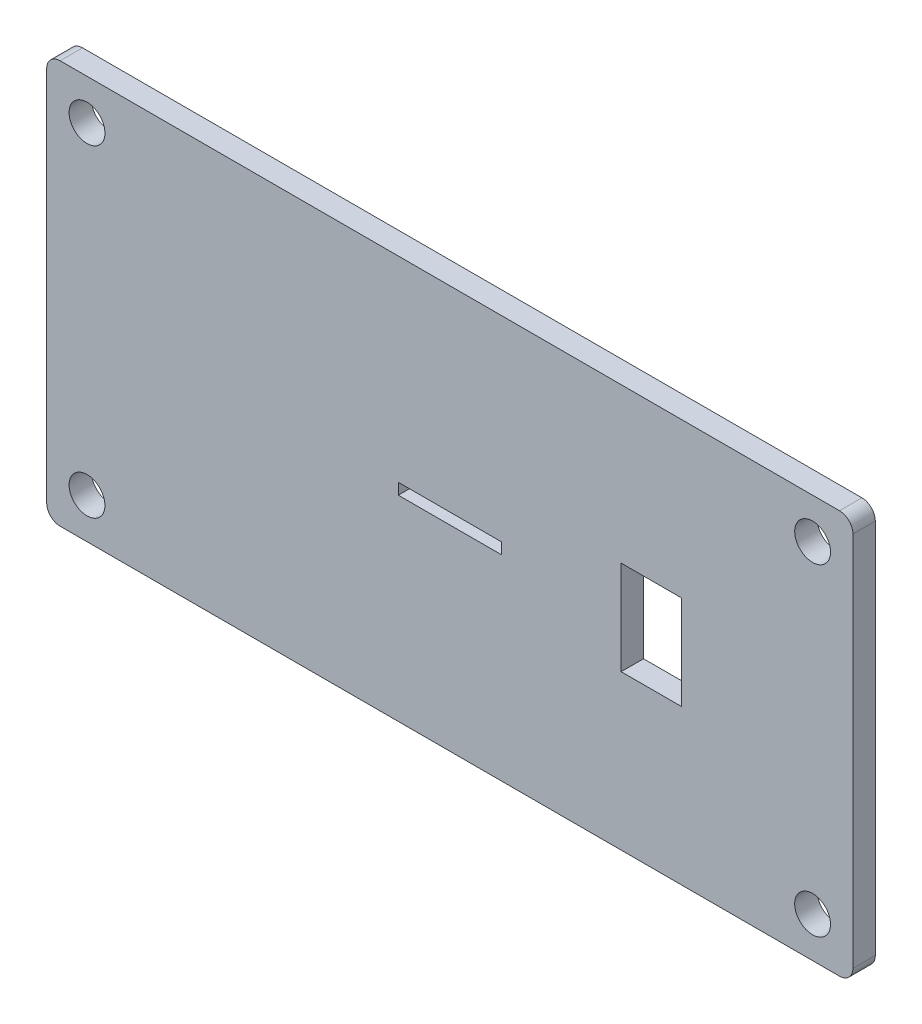
ISO-10303-21;
HEADER;
FILE_DESCRIPTION(('STEP AP214'),'2;1');
FILE_NAME('part.step','',(''),(''),'','','');
FILE_SCHEMA(('AUTOMOTIVE_DESIGN { 1 0 10303 214 1 1 1 1 }'));
ENDSEC;
DATA;
#1=APPLICATION_CONTEXT('core data for automotive mechanical design processes');
#2=APPLICATION_PROTOCOL_DEFINITION('international standard','automotive_design',2000,#1);
#3=PRODUCT_CONTEXT('',#1,'mechanical');
#4=PRODUCT('Part','Part','',(#3));
#5=PRODUCT_RELATED_PRODUCT_CATEGORY('part','',(#4));
#6=PRODUCT_DEFINITION_FORMATION('','',#4);
#7=PRODUCT_DEFINITION_CONTEXT('part definition',#1,'design');
#8=PRODUCT_DEFINITION('design','',#6,#7);
#9=PRODUCT_DEFINITION_SHAPE('','',#8);
#10=(LENGTH_UNIT() NAMED_UNIT(*) SI_UNIT(.MILLI.,.METRE.));
#11=(NAMED_UNIT(*) PLANE_ANGLE_UNIT() SI_UNIT($,.RADIAN.));
#12=(NAMED_UNIT(*) SI_UNIT($,.STERADIAN.) SOLID_ANGLE_UNIT());
#13=UNCERTAINTY_MEASURE_WITH_UNIT(LENGTH_MEASURE(1.E-05),#10,'distance_accuracy_value','');
#14=(GEOMETRIC_REPRESENTATION_CONTEXT(3) GLOBAL_UNCERTAINTY_ASSIGNED_CONTEXT((#13)) GLOBAL_UNIT_ASSIGNED_CONTEXT((#10,
#11,#12)) REPRESENTATION_CONTEXT('',''));
#15=CARTESIAN_POINT('',(0.,0.,0.));
#16=DIRECTION('',(0.,0.,1.));
#17=DIRECTION('',(1.,0.,0.));
#18=AXIS2_PLACEMENT_3D('',#15,#16,#17);
#19=CARTESIAN_POINT('',(90.,45.,5.));
#20=DIRECTION('',(-1.,0.,0.));
#21=DIRECTION('',(0.,0.,1.));
#22=AXIS2_PLACEMENT_3D('',#19,#20,#21);
#23=PLANE('',#22);
#24=DIRECTION('',(0.,1.,0.));
#25=VECTOR('',#24,1.);
#26=CARTESIAN_POINT('',(90.,45.,5.));
#27=LINE('',#26,#25);
#28=CARTESIAN_POINT('',(90.,-42.,5.));
#29=VERTEX_POINT('',#28);
#30=CARTESIAN_POINT('',(90.,42.,5.));
#31=VERTEX_POINT('',#30);
#32=EDGE_CURVE('E238',#29,#31,#27,.T.);
#33=ORIENTED_EDGE('',*,*,#32,.F.);
#34=DIRECTION('',(0.,0.,-1.));
#35=VECTOR('',#34,1.);
#36=CARTESIAN_POINT('',(90.,-42.,5.));
#37=LINE('',#36,#35);
#38=CARTESIAN_POINT('',(90.,-42.,0.));
#39=VERTEX_POINT('',#38);
#40=EDGE_CURVE('E268',#29,#39,#37,.T.);
#41=ORIENTED_EDGE('',*,*,#40,.T.);
#42=DIRECTION('',(0.,1.,0.));
#43=VECTOR('',#42,1.);
#44=CARTESIAN_POINT('',(90.,45.,0.));
#45=LINE('',#44,#43);
#46=CARTESIAN_POINT('',(90.,42.,0.));
#47=VERTEX_POINT('',#46);
#48=EDGE_CURVE('E235',#39,#47,#45,.T.);
#49=ORIENTED_EDGE('',*,*,#48,.T.);
#50=DIRECTION('',(0.,0.,-1.));
#51=VECTOR('',#50,1.);
#52=CARTESIAN_POINT('',(90.,42.,5.));
#53=LINE('',#52,#51);
#54=EDGE_CURVE('E263',#47,#31,#53,.F.);
#55=ORIENTED_EDGE('',*,*,#54,.T.);
#56=EDGE_LOOP('',(#33,#41,#49,#55));
#57=FACE_BOUND('',#56,.T.);
#58=ADVANCED_FACE('F33',(#57),#23,.F.);
#59=CARTESIAN_POINT('',(-90.,45.,5.));
#60=DIRECTION('',(0.,-1.,0.));
#61=DIRECTION('',(0.,0.,-1.));
#62=AXIS2_PLACEMENT_3D('',#59,#60,#61);
#63=PLANE('',#62);
#64=DIRECTION('',(-1.,0.,0.));
#65=VECTOR('',#64,1.);
#66=CARTESIAN_POINT('',(-90.,45.,0.));
#67=LINE('',#66,#65);
#68=CARTESIAN_POINT('',(87.,45.,0.));
#69=VERTEX_POINT('',#68);
#70=CARTESIAN_POINT('',(-87.,45.,0.));
#71=VERTEX_POINT('',#70);
#72=EDGE_CURVE('E251',#69,#71,#67,.T.);
#73=ORIENTED_EDGE('',*,*,#72,.T.);
#74=DIRECTION('',(0.,0.,-1.));
#75=VECTOR('',#74,1.);
#76=CARTESIAN_POINT('',(-87.,45.,5.));
#77=LINE('',#76,#75);
#78=CARTESIAN_POINT('',(-87.,45.,5.));
#79=VERTEX_POINT('',#78);
#80=EDGE_CURVE('E284',#71,#79,#77,.F.);
#81=ORIENTED_EDGE('',*,*,#80,.T.);
#82=DIRECTION('',(-1.,0.,0.));
#83=VECTOR('',#82,1.);
#84=CARTESIAN_POINT('',(-90.,45.,5.));
#85=LINE('',#84,#83);
#86=CARTESIAN_POINT('',(87.,45.,5.));
#87=VERTEX_POINT('',#86);
#88=EDGE_CURVE('E240',#87,#79,#85,.T.);
#89=ORIENTED_EDGE('',*,*,#88,.F.);
#90=DIRECTION('',(0.,0.,-1.));
#91=VECTOR('',#90,1.);
#92=CARTESIAN_POINT('',(87.,45.,5.));
#93=LINE('',#92,#91);
#94=EDGE_CURVE('E249',#87,#69,#93,.T.);
#95=ORIENTED_EDGE('',*,*,#94,.T.);
#96=EDGE_LOOP('',(#73,#81,#89,#95));
#97=FACE_BOUND('',#96,.T.);
#98=ADVANCED_FACE('F324',(#97),#63,.F.);
#99=CARTESIAN_POINT('',(-90.,45.,5.));
#100=DIRECTION('',(1.,0.,0.));
#101=DIRECTION('',(0.,0.,-1.));
#102=AXIS2_PLACEMENT_3D('',#99,#100,#101);
#103=PLANE('',#102);
#104=DIRECTION('',(0.,-1.,0.));
#105=VECTOR('',#104,1.);
#106=CARTESIAN_POINT('',(-90.,45.,0.));
#107=LINE('',#106,#105);
#108=CARTESIAN_POINT('',(-90.,42.,0.));
#109=VERTEX_POINT('',#108);
#110=CARTESIAN_POINT('',(-90.,-42.,0.));
#111=VERTEX_POINT('',#110);
#112=EDGE_CURVE('E254',#109,#111,#107,.T.);
#113=ORIENTED_EDGE('',*,*,#112,.T.);
#114=DIRECTION('',(0.,0.,-1.));
#115=VECTOR('',#114,1.);
#116=CARTESIAN_POINT('',(-90.,-42.,5.));
#117=LINE('',#116,#115);
#118=CARTESIAN_POINT('',(-90.,-42.,5.));
#119=VERTEX_POINT('',#118);
#120=EDGE_CURVE('E41',#111,#119,#117,.F.);
#121=ORIENTED_EDGE('',*,*,#120,.T.);
#122=DIRECTION('',(0.,-1.,0.));
#123=VECTOR('',#122,1.);
#124=CARTESIAN_POINT('',(-90.,45.,5.));
#125=LINE('',#124,#123);
#126=CARTESIAN_POINT('',(-90.,42.,5.));
#127=VERTEX_POINT('',#126);
#128=EDGE_CURVE('E244',#127,#119,#125,.T.);
#129=ORIENTED_EDGE('',*,*,#128,.F.);
#130=DIRECTION('',(0.,0.,-1.));
#131=VECTOR('',#130,1.);
#132=CARTESIAN_POINT('',(-90.,42.,5.));
#133=LINE('',#132,#131);
#134=EDGE_CURVE('E279',#127,#109,#133,.T.);
#135=ORIENTED_EDGE('',*,*,#134,.T.);
#136=EDGE_LOOP('',(#113,#121,#129,#135));
#137=FACE_BOUND('',#136,.T.);
#138=ADVANCED_FACE('F295',(#137),#103,.F.);
#139=CARTESIAN_POINT('',(-90.,-45.,5.));
#140=DIRECTION('',(0.,1.,0.));
#141=DIRECTION('',(0.,0.,1.));
#142=AXIS2_PLACEMENT_3D('',#139,#140,#141);
#143=PLANE('',#142);
#144=DIRECTION('',(1.,0.,0.));
#145=VECTOR('',#144,1.);
#146=CARTESIAN_POINT('',(-90.,-45.,5.));
#147=LINE('',#146,#145);
#148=CARTESIAN_POINT('',(-87.,-45.,5.));
#149=VERTEX_POINT('',#148);
#150=CARTESIAN_POINT('',(87.,-45.,5.));
#151=VERTEX_POINT('',#150);
#152=EDGE_CURVE('E247',#149,#151,#147,.T.);
#153=ORIENTED_EDGE('',*,*,#152,.F.);
#154=DIRECTION('',(0.,0.,-1.));
#155=VECTOR('',#154,1.);
#156=CARTESIAN_POINT('',(-87.,-45.,5.));
#157=LINE('',#156,#155);
#158=CARTESIAN_POINT('',(-87.,-45.,0.));
#159=VERTEX_POINT('',#158);
#160=EDGE_CURVE('E288',#149,#159,#157,.T.);
#161=ORIENTED_EDGE('',*,*,#160,.T.);
#162=DIRECTION('',(1.,0.,0.));
#163=VECTOR('',#162,1.);
#164=CARTESIAN_POINT('',(-90.,-45.,0.));
#165=LINE('',#164,#163);
#166=CARTESIAN_POINT('',(87.,-45.,0.));
#167=VERTEX_POINT('',#166);
#168=EDGE_CURVE('E241',#159,#167,#165,.T.);
#169=ORIENTED_EDGE('',*,*,#168,.T.);
#170=DIRECTION('',(0.,0.,-1.));
#171=VECTOR('',#170,1.);
#172=CARTESIAN_POINT('',(87.,-45.,5.));
#173=LINE('',#172,#171);
#174=EDGE_CURVE('E274',#167,#151,#173,.F.);
#175=ORIENTED_EDGE('',*,*,#174,.T.);
#176=EDGE_LOOP('',(#153,#161,#169,#175));
#177=FACE_BOUND('',#176,.T.);
#178=ADVANCED_FACE('F307',(#177),#143,.F.);
#179=CARTESIAN_POINT('',(0.,0.,5.));
#180=DIRECTION('',(0.,0.,1.));
#181=DIRECTION('',(1.,0.,0.));
#182=AXIS2_PLACEMENT_3D('',#179,#180,#181);
#183=PLANE('',#182);
#184=DIRECTION('',(0.,-1.,0.));
#185=VECTOR('',#184,1.);
#186=CARTESIAN_POINT('',(38.25,-10.5,5.));
#187=LINE('',#186,#185);
#188=CARTESIAN_POINT('',(38.25,10.5,5.));
#189=VERTEX_POINT('',#188);
#190=CARTESIAN_POINT('',(38.25,-10.5,5.));
#191=VERTEX_POINT('',#190);
#192=EDGE_CURVE('E48',#189,#191,#187,.T.);
#193=ORIENTED_EDGE('',*,*,#192,.F.);
#194=DIRECTION('',(-1.,0.,0.));
#195=VECTOR('',#194,1.);
#196=CARTESIAN_POINT('',(51.75,10.5,5.));
#197=LINE('',#196,#195);
#198=CARTESIAN_POINT('',(51.75,10.5,5.));
#199=VERTEX_POINT('',#198);
#200=EDGE_CURVE('E163',#199,#189,#197,.T.);
#201=ORIENTED_EDGE('',*,*,#200,.F.);
#202=DIRECTION('',(0.,1.,0.));
#203=VECTOR('',#202,1.);
#204=CARTESIAN_POINT('',(51.75,-10.5,5.));
#205=LINE('',#204,#203);
#206=CARTESIAN_POINT('',(51.75,-10.5,5.));
#207=VERTEX_POINT('',#206);
#208=EDGE_CURVE('E166',#207,#199,#205,.T.);
#209=ORIENTED_EDGE('',*,*,#208,.F.);
#210=DIRECTION('',(1.,0.,0.));
#211=VECTOR('',#210,1.);
#212=CARTESIAN_POINT('',(51.75,-10.5,5.));
#213=LINE('',#212,#211);
#214=EDGE_CURVE('E172',#191,#207,#213,.T.);
#215=ORIENTED_EDGE('',*,*,#214,.F.);
#216=EDGE_LOOP('',(#193,#201,#209,#215));
#217=FACE_BOUND('',#216,.T.);
#218=DIRECTION('',(0.,1.,0.));
#219=VECTOR('',#218,1.);
#220=CARTESIAN_POINT('',(-11.5,-1.25,5.));
#221=LINE('',#220,#219);
#222=CARTESIAN_POINT('',(-11.5,-1.25,5.));
#223=VERTEX_POINT('',#222);
#224=CARTESIAN_POINT('',(-11.5,1.25,5.));
#225=VERTEX_POINT('',#224);
#226=EDGE_CURVE('E182',#223,#225,#221,.T.);
#227=ORIENTED_EDGE('',*,*,#226,.T.);
#228=DIRECTION('',(1.,0.,0.));
#229=VECTOR('',#228,1.);
#230=CARTESIAN_POINT('',(11.5,1.25,5.));
#231=LINE('',#230,#229);
#232=CARTESIAN_POINT('',(11.5,1.25,5.));
#233=VERTEX_POINT('',#232);
#234=EDGE_CURVE('E185',#225,#233,#231,.T.);
#235=ORIENTED_EDGE('',*,*,#234,.T.);
#236=DIRECTION('',(0.,-1.,0.));
#237=VECTOR('',#236,1.);
#238=CARTESIAN_POINT('',(11.5,-1.25,5.));
#239=LINE('',#238,#237);
#240=CARTESIAN_POINT('',(11.5,-1.25,5.));
#241=VERTEX_POINT('',#240);
#242=EDGE_CURVE('E189',#233,#241,#239,.T.);
#243=ORIENTED_EDGE('',*,*,#242,.T.);
#244=DIRECTION('',(-1.,0.,0.));
#245=VECTOR('',#244,1.);
#246=CARTESIAN_POINT('',(11.5,-1.25,5.));
#247=LINE('',#246,#245);
#248=EDGE_CURVE('E192',#241,#223,#247,.T.);
#249=ORIENTED_EDGE('',*,*,#248,.T.);
#250=EDGE_LOOP('',(#227,#235,#243,#249));
#251=FACE_BOUND('',#250,.T.);
#252=CARTESIAN_POINT('',(-81.,-36.,5.));
#253=DIRECTION('',(0.,0.,1.));
#254=DIRECTION('',(-1.,0.,0.));
#255=AXIS2_PLACEMENT_3D('',#252,#253,#254);
#256=CIRCLE('',#255,4.00000000000001);
#257=CARTESIAN_POINT('',(-85.,-36.,5.));
#258=VERTEX_POINT('',#257);
#259=EDGE_CURVE('E207',#258,#258,#256,.T.);
#260=ORIENTED_EDGE('',*,*,#259,.F.);
#261=EDGE_LOOP('',(#260));
#262=FACE_BOUND('',#261,.T.);
#263=CARTESIAN_POINT('',(81.,-36.,5.));
#264=DIRECTION('',(0.,0.,1.));
#265=DIRECTION('',(1.,0.,0.));
#266=AXIS2_PLACEMENT_3D('',#263,#264,#265);
#267=CIRCLE('',#266,4.00000000000001);
#268=CARTESIAN_POINT('',(85.,-36.,5.));
#269=VERTEX_POINT('',#268);
#270=EDGE_CURVE('E224',#269,#269,#267,.T.);
#271=ORIENTED_EDGE('',*,*,#270,.F.);
#272=EDGE_LOOP('',(#271));
#273=FACE_BOUND('',#272,.T.);
#274=CARTESIAN_POINT('',(81.,36.,5.));
#275=DIRECTION('',(0.,0.,1.));
#276=DIRECTION('',(-1.,0.,0.));
#277=AXIS2_PLACEMENT_3D('',#274,#275,#276);
#278=CIRCLE('',#277,4.00000000000001);
#279=CARTESIAN_POINT('',(77.,36.,5.));
#280=VERTEX_POINT('',#279);
#281=EDGE_CURVE('E218',#280,#280,#278,.T.);
#282=ORIENTED_EDGE('',*,*,#281,.F.);
#283=EDGE_LOOP('',(#282));
#284=FACE_BOUND('',#283,.T.);
#285=CARTESIAN_POINT('',(-81.,36.,5.));
#286=DIRECTION('',(0.,0.,1.));
#287=DIRECTION('',(1.,0.,0.));
#288=AXIS2_PLACEMENT_3D('',#285,#286,#287);
#289=CIRCLE('',#288,4.00000000000001);
#290=CARTESIAN_POINT('',(-77.,36.,5.));
#291=VERTEX_POINT('',#290);
#292=EDGE_CURVE('E217',#291,#291,#289,.T.);
#293=ORIENTED_EDGE('',*,*,#292,.F.);
#294=EDGE_LOOP('',(#293));
#295=FACE_BOUND('',#294,.T.);
#296=ORIENTED_EDGE('',*,*,#128,.T.);
#297=CARTESIAN_POINT('',(-87.,-42.,5.));
#298=DIRECTION('',(0.,0.,1.));
#299=DIRECTION('',(1.,0.,0.));
#300=AXIS2_PLACEMENT_3D('',#297,#298,#299);
#301=CIRCLE('',#300,3.);
#302=EDGE_CURVE('E11',#119,#149,#301,.T.);
#303=ORIENTED_EDGE('',*,*,#302,.T.);
#304=ORIENTED_EDGE('',*,*,#152,.T.);
#305=CARTESIAN_POINT('',(87.,-42.,5.));
#306=DIRECTION('',(0.,0.,1.));
#307=DIRECTION('',(1.,0.,0.));
#308=AXIS2_PLACEMENT_3D('',#305,#306,#307);
#309=CIRCLE('',#308,3.);
#310=EDGE_CURVE('E277',#151,#29,#309,.T.);
#311=ORIENTED_EDGE('',*,*,#310,.T.);
#312=ORIENTED_EDGE('',*,*,#32,.T.);
#313=CARTESIAN_POINT('',(87.,42.,5.));
#314=DIRECTION('',(0.,0.,1.));
#315=DIRECTION('',(1.,0.,0.));
#316=AXIS2_PLACEMENT_3D('',#313,#314,#315);
#317=CIRCLE('',#316,3.);
#318=EDGE_CURVE('E266',#31,#87,#317,.T.);
#319=ORIENTED_EDGE('',*,*,#318,.T.);
#320=ORIENTED_EDGE('',*,*,#88,.T.);
#321=CARTESIAN_POINT('',(-87.,42.,5.));
#322=DIRECTION('',(0.,0.,1.));
#323=DIRECTION('',(1.,0.,0.));
#324=AXIS2_PLACEMENT_3D('',#321,#322,#323);
#325=CIRCLE('',#324,3.);
#326=EDGE_CURVE('E286',#79,#127,#325,.T.);
#327=ORIENTED_EDGE('',*,*,#326,.T.);
#328=EDGE_LOOP('',(#296,#303,#304,#311,#312,#319,#320,#327));
#329=FACE_BOUND('',#328,.T.);
#330=ADVANCED_FACE('F301',(#217,#251,#262,#273,#284,#295,#329),#183,.T.);
#331=CARTESIAN_POINT('',(0.,0.,0.));
#332=DIRECTION('',(0.,0.,1.));
#333=DIRECTION('',(1.,0.,0.));
#334=AXIS2_PLACEMENT_3D('',#331,#332,#333);
#335=PLANE('',#334);
#336=DIRECTION('',(-1.,0.,0.));
#337=VECTOR('',#336,1.);
#338=CARTESIAN_POINT('',(51.75,10.5,0.));
#339=LINE('',#338,#337);
#340=CARTESIAN_POINT('',(51.75,10.5,0.));
#341=VERTEX_POINT('',#340);
#342=CARTESIAN_POINT('',(38.25,10.5,0.));
#343=VERTEX_POINT('',#342);
#344=EDGE_CURVE('E153',#341,#343,#339,.T.);
#345=ORIENTED_EDGE('',*,*,#344,.T.);
#346=DIRECTION('',(0.,-1.,0.));
#347=VECTOR('',#346,1.);
#348=CARTESIAN_POINT('',(38.25,-10.5,0.));
#349=LINE('',#348,#347);
#350=CARTESIAN_POINT('',(38.25,-10.5,0.));
#351=VERTEX_POINT('',#350);
#352=EDGE_CURVE('E147',#343,#351,#349,.T.);
#353=ORIENTED_EDGE('',*,*,#352,.T.);
#354=DIRECTION('',(1.,0.,0.));
#355=VECTOR('',#354,1.);
#356=CARTESIAN_POINT('',(51.75,-10.5,0.));
#357=LINE('',#356,#355);
#358=CARTESIAN_POINT('',(51.75,-10.5,0.));
#359=VERTEX_POINT('',#358);
#360=EDGE_CURVE('E156',#351,#359,#357,.T.);
#361=ORIENTED_EDGE('',*,*,#360,.T.);
#362=DIRECTION('',(0.,1.,0.));
#363=VECTOR('',#362,1.);
#364=CARTESIAN_POINT('',(51.75,-10.5,0.));
#365=LINE('',#364,#363);
#366=EDGE_CURVE('E56',#359,#341,#365,.T.);
#367=ORIENTED_EDGE('',*,*,#366,.T.);
#368=EDGE_LOOP('',(#345,#353,#361,#367));
#369=FACE_BOUND('',#368,.T.);
#370=DIRECTION('',(1.,0.,0.));
#371=VECTOR('',#370,1.);
#372=CARTESIAN_POINT('',(11.5,1.25,0.));
#373=LINE('',#372,#371);
#374=CARTESIAN_POINT('',(-11.5,1.25,0.));
#375=VERTEX_POINT('',#374);
#376=CARTESIAN_POINT('',(11.5,1.25,0.));
#377=VERTEX_POINT('',#376);
#378=EDGE_CURVE('E197',#375,#377,#373,.T.);
#379=ORIENTED_EDGE('',*,*,#378,.F.);
#380=DIRECTION('',(0.,1.,0.));
#381=VECTOR('',#380,1.);
#382=CARTESIAN_POINT('',(-11.5,-1.25,0.));
#383=LINE('',#382,#381);
#384=CARTESIAN_POINT('',(-11.5,-1.25,0.));
#385=VERTEX_POINT('',#384);
#386=EDGE_CURVE('E178',#385,#375,#383,.T.);
#387=ORIENTED_EDGE('',*,*,#386,.F.);
#388=DIRECTION('',(-1.,0.,0.));
#389=VECTOR('',#388,1.);
#390=CARTESIAN_POINT('',(11.5,-1.25,0.));
#391=LINE('',#390,#389);
#392=CARTESIAN_POINT('',(11.5,-1.25,0.));
#393=VERTEX_POINT('',#392);
#394=EDGE_CURVE('E186',#393,#385,#391,.T.);
#395=ORIENTED_EDGE('',*,*,#394,.F.);
#396=DIRECTION('',(0.,-1.,0.));
#397=VECTOR('',#396,1.);
#398=CARTESIAN_POINT('',(11.5,-1.25,0.));
#399=LINE('',#398,#397);
#400=EDGE_CURVE('E200',#377,#393,#399,.T.);
#401=ORIENTED_EDGE('',*,*,#400,.F.);
#402=EDGE_LOOP('',(#379,#387,#395,#401));
#403=FACE_BOUND('',#402,.T.);
#404=CARTESIAN_POINT('',(-81.,-36.,0.));
#405=DIRECTION('',(0.,0.,1.));
#406=DIRECTION('',(-1.,0.,0.));
#407=AXIS2_PLACEMENT_3D('',#404,#405,#406);
#408=CIRCLE('',#407,4.00000000000001);
#409=CARTESIAN_POINT('',(-85.,-36.,0.));
#410=VERTEX_POINT('',#409);
#411=EDGE_CURVE('E227',#410,#410,#408,.T.);
#412=ORIENTED_EDGE('',*,*,#411,.T.);
#413=EDGE_LOOP('',(#412));
#414=FACE_BOUND('',#413,.T.);
#415=CARTESIAN_POINT('',(81.,-36.,0.));
#416=DIRECTION('',(0.,0.,1.));
#417=DIRECTION('',(1.,0.,0.));
#418=AXIS2_PLACEMENT_3D('',#415,#416,#417);
#419=CIRCLE('',#418,4.00000000000001);
#420=CARTESIAN_POINT('',(85.,-36.,0.));
#421=VERTEX_POINT('',#420);
#422=EDGE_CURVE('E221',#421,#421,#419,.T.);
#423=ORIENTED_EDGE('',*,*,#422,.T.);
#424=EDGE_LOOP('',(#423));
#425=FACE_BOUND('',#424,.T.);
#426=CARTESIAN_POINT('',(81.,36.,0.));
#427=DIRECTION('',(0.,0.,1.));
#428=DIRECTION('',(-1.,0.,0.));
#429=AXIS2_PLACEMENT_3D('',#426,#427,#428);
#430=CIRCLE('',#429,4.00000000000001);
#431=CARTESIAN_POINT('',(77.,36.,0.));
#432=VERTEX_POINT('',#431);
#433=EDGE_CURVE('E214',#432,#432,#430,.T.);
#434=ORIENTED_EDGE('',*,*,#433,.T.);
#435=EDGE_LOOP('',(#434));
#436=FACE_BOUND('',#435,.T.);
#437=CARTESIAN_POINT('',(-81.,36.,0.));
#438=DIRECTION('',(0.,0.,1.));
#439=DIRECTION('',(1.,0.,0.));
#440=AXIS2_PLACEMENT_3D('',#437,#438,#439);
#441=CIRCLE('',#440,4.00000000000001);
#442=CARTESIAN_POINT('',(-77.,36.,0.));
#443=VERTEX_POINT('',#442);
#444=EDGE_CURVE('E232',#443,#443,#441,.T.);
#445=ORIENTED_EDGE('',*,*,#444,.T.);
#446=EDGE_LOOP('',(#445));
#447=FACE_BOUND('',#446,.T.);
#448=ORIENTED_EDGE('',*,*,#168,.F.);
#449=CARTESIAN_POINT('',(-87.,-42.,0.));
#450=DIRECTION('',(0.,0.,1.));
#451=DIRECTION('',(1.,0.,0.));
#452=AXIS2_PLACEMENT_3D('',#449,#450,#451);
#453=CIRCLE('',#452,3.);
#454=EDGE_CURVE('E291',#159,#111,#453,.F.);
#455=ORIENTED_EDGE('',*,*,#454,.T.);
#456=ORIENTED_EDGE('',*,*,#112,.F.);
#457=CARTESIAN_POINT('',(-87.,42.,0.));
#458=DIRECTION('',(0.,0.,1.));
#459=DIRECTION('',(1.,0.,0.));
#460=AXIS2_PLACEMENT_3D('',#457,#458,#459);
#461=CIRCLE('',#460,3.);
#462=EDGE_CURVE('E282',#109,#71,#461,.F.);
#463=ORIENTED_EDGE('',*,*,#462,.T.);
#464=ORIENTED_EDGE('',*,*,#72,.F.);
#465=CARTESIAN_POINT('',(87.,42.,0.));
#466=DIRECTION('',(0.,0.,1.));
#467=DIRECTION('',(1.,0.,0.));
#468=AXIS2_PLACEMENT_3D('',#465,#466,#467);
#469=CIRCLE('',#468,3.);
#470=EDGE_CURVE('E260',#69,#47,#469,.F.);
#471=ORIENTED_EDGE('',*,*,#470,.T.);
#472=ORIENTED_EDGE('',*,*,#48,.F.);
#473=CARTESIAN_POINT('',(87.,-42.,0.));
#474=DIRECTION('',(0.,0.,1.));
#475=DIRECTION('',(1.,0.,0.));
#476=AXIS2_PLACEMENT_3D('',#473,#474,#475);
#477=CIRCLE('',#476,3.);
#478=EDGE_CURVE('E271',#39,#167,#477,.F.);
#479=ORIENTED_EDGE('',*,*,#478,.T.);
#480=EDGE_LOOP('',(#448,#455,#456,#463,#464,#471,#472,#479));
#481=FACE_BOUND('',#480,.T.);
#482=ADVANCED_FACE('F160',(#369,#403,#414,#425,#436,#447,#481),#335,.F.);
#483=CARTESIAN_POINT('',(-81.,36.,0.));
#484=DIRECTION('',(0.,0.,1.));
#485=DIRECTION('',(1.,0.,0.));
#486=AXIS2_PLACEMENT_3D('',#483,#484,#485);
#487=CYLINDRICAL_SURFACE('',#486,4.00000000000001);
#488=ORIENTED_EDGE('',*,*,#444,.F.);
#489=EDGE_LOOP('',(#488));
#490=FACE_BOUND('',#489,.T.);
#491=ORIENTED_EDGE('',*,*,#292,.T.);
#492=EDGE_LOOP('',(#491));
#493=FACE_BOUND('',#492,.T.);
#494=ADVANCED_FACE('F369',(#490,#493),#487,.F.);
#495=CARTESIAN_POINT('',(81.,36.,0.));
#496=DIRECTION('',(0.,0.,1.));
#497=DIRECTION('',(1.,0.,0.));
#498=AXIS2_PLACEMENT_3D('',#495,#496,#497);
#499=CYLINDRICAL_SURFACE('',#498,4.00000000000001);
#500=ORIENTED_EDGE('',*,*,#433,.F.);
#501=EDGE_LOOP('',(#500));
#502=FACE_BOUND('',#501,.T.);
#503=ORIENTED_EDGE('',*,*,#281,.T.);
#504=EDGE_LOOP('',(#503));
#505=FACE_BOUND('',#504,.T.);
#506=ADVANCED_FACE('F365',(#502,#505),#499,.F.);
#507=CARTESIAN_POINT('',(81.,-36.,0.));
#508=DIRECTION('',(0.,0.,1.));
#509=DIRECTION('',(1.,0.,0.));
#510=AXIS2_PLACEMENT_3D('',#507,#508,#509);
#511=CYLINDRICAL_SURFACE('',#510,4.00000000000001);
#512=ORIENTED_EDGE('',*,*,#422,.F.);
#513=EDGE_LOOP('',(#512));
#514=FACE_BOUND('',#513,.T.);
#515=ORIENTED_EDGE('',*,*,#270,.T.);
#516=EDGE_LOOP('',(#515));
#517=FACE_BOUND('',#516,.T.);
#518=ADVANCED_FACE('F368',(#514,#517),#511,.F.);
#519=CARTESIAN_POINT('',(-81.,-36.,0.));
#520=DIRECTION('',(0.,0.,1.));
#521=DIRECTION('',(1.,0.,0.));
#522=AXIS2_PLACEMENT_3D('',#519,#520,#521);
#523=CYLINDRICAL_SURFACE('',#522,4.00000000000001);
#524=ORIENTED_EDGE('',*,*,#411,.F.);
#525=EDGE_LOOP('',(#524));
#526=FACE_BOUND('',#525,.T.);
#527=ORIENTED_EDGE('',*,*,#259,.T.);
#528=EDGE_LOOP('',(#527));
#529=FACE_BOUND('',#528,.T.);
#530=ADVANCED_FACE('F363',(#526,#529),#523,.F.);
#531=CARTESIAN_POINT('',(-11.5,-1.25,5.));
#532=DIRECTION('',(-1.,0.,0.));
#533=DIRECTION('',(0.,0.,1.));
#534=AXIS2_PLACEMENT_3D('',#531,#532,#533);
#535=PLANE('',#534);
#536=ORIENTED_EDGE('',*,*,#386,.T.);
#537=DIRECTION('',(0.,0.,-1.));
#538=VECTOR('',#537,1.);
#539=CARTESIAN_POINT('',(-11.5,1.25,5.));
#540=LINE('',#539,#538);
#541=EDGE_CURVE('E195',#225,#375,#540,.T.);
#542=ORIENTED_EDGE('',*,*,#541,.F.);
#543=ORIENTED_EDGE('',*,*,#226,.F.);
#544=DIRECTION('',(0.,0.,-1.));
#545=VECTOR('',#544,1.);
#546=CARTESIAN_POINT('',(-11.5,-1.25,5.));
#547=LINE('',#546,#545);
#548=EDGE_CURVE('E205',#223,#385,#547,.T.);
#549=ORIENTED_EDGE('',*,*,#548,.T.);
#550=EDGE_LOOP('',(#536,#542,#543,#549));
#551=FACE_BOUND('',#550,.T.);
#552=ADVANCED_FACE('F360',(#551),#535,.F.);
#553=CARTESIAN_POINT('',(11.5,-1.25,5.));
#554=DIRECTION('',(0.,-1.,0.));
#555=DIRECTION('',(0.,0.,-1.));
#556=AXIS2_PLACEMENT_3D('',#553,#554,#555);
#557=PLANE('',#556);
#558=ORIENTED_EDGE('',*,*,#394,.T.);
#559=ORIENTED_EDGE('',*,*,#548,.F.);
#560=ORIENTED_EDGE('',*,*,#248,.F.);
#561=DIRECTION('',(0.,0.,-1.));
#562=VECTOR('',#561,1.);
#563=CARTESIAN_POINT('',(11.5,-1.25,5.));
#564=LINE('',#563,#562);
#565=EDGE_CURVE('E208',#241,#393,#564,.T.);
#566=ORIENTED_EDGE('',*,*,#565,.T.);
#567=EDGE_LOOP('',(#558,#559,#560,#566));
#568=FACE_BOUND('',#567,.T.);
#569=ADVANCED_FACE('F355',(#568),#557,.F.);
#570=CARTESIAN_POINT('',(11.5,-1.25,5.));
#571=DIRECTION('',(1.,0.,0.));
#572=DIRECTION('',(0.,0.,-1.));
#573=AXIS2_PLACEMENT_3D('',#570,#571,#572);
#574=PLANE('',#573);
#575=ORIENTED_EDGE('',*,*,#400,.T.);
#576=ORIENTED_EDGE('',*,*,#565,.F.);
#577=ORIENTED_EDGE('',*,*,#242,.F.);
#578=DIRECTION('',(0.,0.,-1.));
#579=VECTOR('',#578,1.);
#580=CARTESIAN_POINT('',(11.5,1.25,5.));
#581=LINE('',#580,#579);
#582=EDGE_CURVE('E210',#233,#377,#581,.T.);
#583=ORIENTED_EDGE('',*,*,#582,.T.);
#584=EDGE_LOOP('',(#575,#576,#577,#583));
#585=FACE_BOUND('',#584,.T.);
#586=ADVANCED_FACE('F349',(#585),#574,.F.);
#587=CARTESIAN_POINT('',(11.5,1.25,5.));
#588=DIRECTION('',(0.,1.,0.));
#589=DIRECTION('',(0.,0.,1.));
#590=AXIS2_PLACEMENT_3D('',#587,#588,#589);
#591=PLANE('',#590);
#592=ORIENTED_EDGE('',*,*,#378,.T.);
#593=ORIENTED_EDGE('',*,*,#582,.F.);
#594=ORIENTED_EDGE('',*,*,#234,.F.);
#595=ORIENTED_EDGE('',*,*,#541,.T.);
#596=EDGE_LOOP('',(#592,#593,#594,#595));
#597=FACE_BOUND('',#596,.T.);
#598=ADVANCED_FACE('F346',(#597),#591,.F.);
#599=CARTESIAN_POINT('',(87.,42.,5.));
#600=DIRECTION('',(0.,0.,-1.));
#601=DIRECTION('',(-1.,0.,0.));
#602=AXIS2_PLACEMENT_3D('',#599,#600,#601);
#603=CYLINDRICAL_SURFACE('',#602,3.);
#604=ORIENTED_EDGE('',*,*,#318,.F.);
#605=ORIENTED_EDGE('',*,*,#54,.F.);
#606=ORIENTED_EDGE('',*,*,#470,.F.);
#607=ORIENTED_EDGE('',*,*,#94,.F.);
#608=EDGE_LOOP('',(#604,#605,#606,#607));
#609=FACE_BOUND('',#608,.T.);
#610=ADVANCED_FACE('F321',(#609),#603,.T.);
#611=CARTESIAN_POINT('',(87.,-42.,5.));
#612=DIRECTION('',(0.,0.,-1.));
#613=DIRECTION('',(-1.,0.,0.));
#614=AXIS2_PLACEMENT_3D('',#611,#612,#613);
#615=CYLINDRICAL_SURFACE('',#614,3.);
#616=ORIENTED_EDGE('',*,*,#310,.F.);
#617=ORIENTED_EDGE('',*,*,#174,.F.);
#618=ORIENTED_EDGE('',*,*,#478,.F.);
#619=ORIENTED_EDGE('',*,*,#40,.F.);
#620=EDGE_LOOP('',(#616,#617,#618,#619));
#621=FACE_BOUND('',#620,.T.);
#622=ADVANCED_FACE('F314',(#621),#615,.T.);
#623=CARTESIAN_POINT('',(-87.,42.,5.));
#624=DIRECTION('',(0.,0.,-1.));
#625=DIRECTION('',(-1.,0.,0.));
#626=AXIS2_PLACEMENT_3D('',#623,#624,#625);
#627=CYLINDRICAL_SURFACE('',#626,3.);
#628=ORIENTED_EDGE('',*,*,#326,.F.);
#629=ORIENTED_EDGE('',*,*,#80,.F.);
#630=ORIENTED_EDGE('',*,*,#462,.F.);
#631=ORIENTED_EDGE('',*,*,#134,.F.);
#632=EDGE_LOOP('',(#628,#629,#630,#631));
#633=FACE_BOUND('',#632,.T.);
#634=ADVANCED_FACE('F328',(#633),#627,.T.);
#635=CARTESIAN_POINT('',(-87.,-42.,5.));
#636=DIRECTION('',(0.,0.,-1.));
#637=DIRECTION('',(-1.,0.,0.));
#638=AXIS2_PLACEMENT_3D('',#635,#636,#637);
#639=CYLINDRICAL_SURFACE('',#638,3.);
#640=ORIENTED_EDGE('',*,*,#302,.F.);
#641=ORIENTED_EDGE('',*,*,#120,.F.);
#642=ORIENTED_EDGE('',*,*,#454,.F.);
#643=ORIENTED_EDGE('',*,*,#160,.F.);
#644=EDGE_LOOP('',(#640,#641,#642,#643));
#645=FACE_BOUND('',#644,.T.);
#646=ADVANCED_FACE('F35',(#645),#639,.T.);
#647=CARTESIAN_POINT('',(38.25,-10.5,0.));
#648=DIRECTION('',(-1.,0.,0.));
#649=DIRECTION('',(0.,-1.,0.));
#650=AXIS2_PLACEMENT_3D('',#647,#648,#649);
#651=PLANE('',#650);
#652=ORIENTED_EDGE('',*,*,#192,.T.);
#653=DIRECTION('',(0.,0.,1.));
#654=VECTOR('',#653,1.);
#655=CARTESIAN_POINT('',(38.25,-10.5,0.));
#656=LINE('',#655,#654);
#657=EDGE_CURVE('E143',#351,#191,#656,.T.);
#658=ORIENTED_EDGE('',*,*,#657,.F.);
#659=ORIENTED_EDGE('',*,*,#352,.F.);
#660=DIRECTION('',(0.,0.,1.));
#661=VECTOR('',#660,1.);
#662=CARTESIAN_POINT('',(38.25,10.5,0.));
#663=LINE('',#662,#661);
#664=EDGE_CURVE('E176',#343,#189,#663,.T.);
#665=ORIENTED_EDGE('',*,*,#664,.T.);
#666=EDGE_LOOP('',(#652,#658,#659,#665));
#667=FACE_BOUND('',#666,.T.);
#668=ADVANCED_FACE('F145',(#667),#651,.F.);
#669=CARTESIAN_POINT('',(51.75,10.5,0.));
#670=DIRECTION('',(0.,1.,0.));
#671=DIRECTION('',(-1.,0.,0.));
#672=AXIS2_PLACEMENT_3D('',#669,#670,#671);
#673=PLANE('',#672);
#674=ORIENTED_EDGE('',*,*,#200,.T.);
#675=ORIENTED_EDGE('',*,*,#664,.F.);
#676=ORIENTED_EDGE('',*,*,#344,.F.);
#677=DIRECTION('',(0.,0.,1.));
#678=VECTOR('',#677,1.);
#679=CARTESIAN_POINT('',(51.75,10.5,0.));
#680=LINE('',#679,#678);
#681=EDGE_CURVE('E179',#341,#199,#680,.T.);
#682=ORIENTED_EDGE('',*,*,#681,.T.);
#683=EDGE_LOOP('',(#674,#675,#676,#682));
#684=FACE_BOUND('',#683,.T.);
#685=ADVANCED_FACE('F417',(#684),#673,.F.);
#686=CARTESIAN_POINT('',(51.75,-10.5,0.));
#687=DIRECTION('',(1.,0.,0.));
#688=DIRECTION('',(0.,1.,0.));
#689=AXIS2_PLACEMENT_3D('',#686,#687,#688);
#690=PLANE('',#689);
#691=ORIENTED_EDGE('',*,*,#208,.T.);
#692=ORIENTED_EDGE('',*,*,#681,.F.);
#693=ORIENTED_EDGE('',*,*,#366,.F.);
#694=DIRECTION('',(0.,0.,1.));
#695=VECTOR('',#694,1.);
#696=CARTESIAN_POINT('',(51.75,-10.5,0.));
#697=LINE('',#696,#695);
#698=EDGE_CURVE('E152',#359,#207,#697,.T.);
#699=ORIENTED_EDGE('',*,*,#698,.T.);
#700=EDGE_LOOP('',(#691,#692,#693,#699));
#701=FACE_BOUND('',#700,.T.);
#702=ADVANCED_FACE('F426',(#701),#690,.F.);
#703=CARTESIAN_POINT('',(51.75,-10.5,0.));
#704=DIRECTION('',(0.,-1.,0.));
#705=DIRECTION('',(1.,0.,0.));
#706=AXIS2_PLACEMENT_3D('',#703,#704,#705);
#707=PLANE('',#706);
#708=ORIENTED_EDGE('',*,*,#214,.T.);
#709=ORIENTED_EDGE('',*,*,#698,.F.);
#710=ORIENTED_EDGE('',*,*,#360,.F.);
#711=ORIENTED_EDGE('',*,*,#657,.T.);
#712=EDGE_LOOP('',(#708,#709,#710,#711));
#713=FACE_BOUND('',#712,.T.);
#714=ADVANCED_FACE('F157',(#713),#707,.F.);
#715=CLOSED_SHELL('',(#58,#98,#138,#178,#330,#482,#494,#506,#518,#530,#552,#569,#586,#598,#610,
#622,#634,#646,#668,#685,#702,#714));
#716=MANIFOLD_SOLID_BREP('B2',#715);
#717=ADVANCED_BREP_SHAPE_REPRESENTATION('',(#18,#716),#14);
#718=SHAPE_DEFINITION_REPRESENTATION(#9,#717);
ENDSEC;
END-ISO-10303-21;
